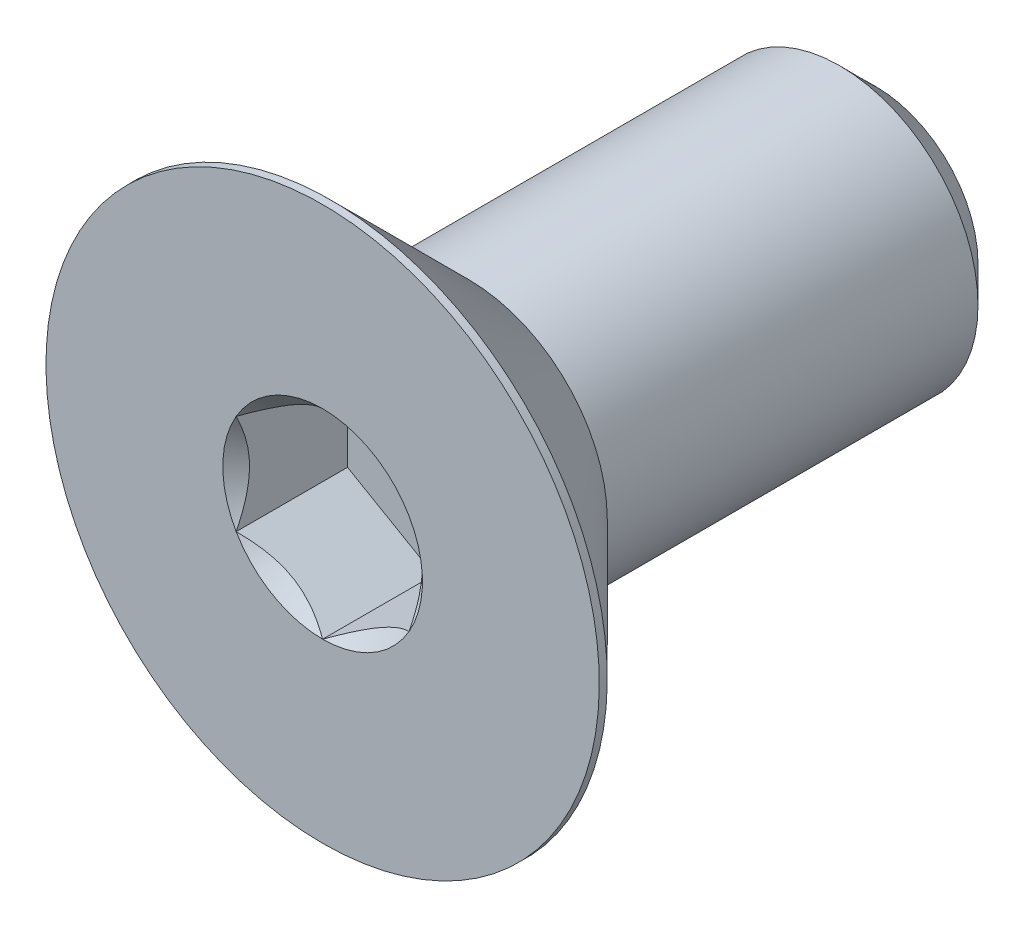
ISO-10303-21;
HEADER;
FILE_DESCRIPTION(('STEP AP214'),'2;1');
FILE_NAME('part.step','',(''),(''),'','','');
FILE_SCHEMA(('AUTOMOTIVE_DESIGN { 1 0 10303 214 1 1 1 1 }'));
ENDSEC;
DATA;
#1=APPLICATION_CONTEXT('core data for automotive mechanical design processes');
#2=APPLICATION_PROTOCOL_DEFINITION('international standard','automotive_design',2000,#1);
#3=PRODUCT_CONTEXT('',#1,'mechanical');
#4=PRODUCT('Part','Part','',(#3));
#5=PRODUCT_RELATED_PRODUCT_CATEGORY('part','',(#4));
#6=PRODUCT_DEFINITION_FORMATION('','',#4);
#7=PRODUCT_DEFINITION_CONTEXT('part definition',#1,'design');
#8=PRODUCT_DEFINITION('design','',#6,#7);
#9=PRODUCT_DEFINITION_SHAPE('','',#8);
#10=(LENGTH_UNIT() NAMED_UNIT(*) SI_UNIT(.MILLI.,.METRE.));
#11=(NAMED_UNIT(*) PLANE_ANGLE_UNIT() SI_UNIT($,.RADIAN.));
#12=(NAMED_UNIT(*) SI_UNIT($,.STERADIAN.) SOLID_ANGLE_UNIT());
#13=UNCERTAINTY_MEASURE_WITH_UNIT(LENGTH_MEASURE(1.E-05),#10,'distance_accuracy_value','');
#14=(GEOMETRIC_REPRESENTATION_CONTEXT(3) GLOBAL_UNCERTAINTY_ASSIGNED_CONTEXT((#13)) GLOBAL_UNIT_ASSIGNED_CONTEXT((#10,
#11,#12)) REPRESENTATION_CONTEXT('',''));
#15=CARTESIAN_POINT('',(0.,0.,0.));
#16=DIRECTION('',(0.,0.,1.));
#17=DIRECTION('',(1.,0.,0.));
#18=AXIS2_PLACEMENT_3D('',#15,#16,#17);
#19=CARTESIAN_POINT('',(0.,0.,3.88500000000001));
#20=DIRECTION('',(0.,0.,1.));
#21=DIRECTION('',(0.,-1.,0.));
#22=AXIS2_PLACEMENT_3D('',#19,#20,#21);
#23=CONICAL_SURFACE('',#22,4.,0.785398163397448);
#24=CARTESIAN_POINT('',(0.,0.,3.88500000000001));
#25=DIRECTION('',(0.,0.,1.));
#26=DIRECTION('',(0.,-1.,0.));
#27=AXIS2_PLACEMENT_3D('',#24,#25,#26);
#28=CIRCLE('',#27,4.);
#29=CARTESIAN_POINT('',(0.,-4.,3.88500000000001));
#30=VERTEX_POINT('',#29);
#31=EDGE_CURVE('E216',#30,#30,#28,.T.);
#32=ORIENTED_EDGE('',*,*,#31,.F.);
#33=EDGE_LOOP('',(#32));
#34=FACE_BOUND('',#33,.T.);
#35=CARTESIAN_POINT('',(0.,0.,1.88500000000001));
#36=DIRECTION('',(0.,0.,1.));
#37=DIRECTION('',(0.,-1.,0.));
#38=AXIS2_PLACEMENT_3D('',#35,#36,#37);
#39=CIRCLE('',#38,2.00000000000001);
#40=CARTESIAN_POINT('',(0.,-2.00000000000001,1.88500000000001));
#41=VERTEX_POINT('',#40);
#42=EDGE_CURVE('E43',#41,#41,#39,.T.);
#43=ORIENTED_EDGE('',*,*,#42,.T.);
#44=EDGE_LOOP('',(#43));
#45=FACE_BOUND('',#44,.T.);
#46=ADVANCED_FACE('F40',(#34,#45),#23,.T.);
#47=CARTESIAN_POINT('',(0.,0.,4.));
#48=DIRECTION('',(0.,0.,-1.));
#49=DIRECTION('',(0.,1.,0.));
#50=AXIS2_PLACEMENT_3D('',#47,#48,#49);
#51=PLANE('',#50);
#52=CARTESIAN_POINT('',(0.,0.,4.));
#53=DIRECTION('',(0.,0.,1.));
#54=DIRECTION('',(0.,-1.,0.));
#55=AXIS2_PLACEMENT_3D('',#52,#53,#54);
#56=CIRCLE('',#55,4.);
#57=CARTESIAN_POINT('',(0.,-4.,4.));
#58=VERTEX_POINT('',#57);
#59=EDGE_CURVE('E48',#58,#58,#56,.T.);
#60=ORIENTED_EDGE('',*,*,#59,.T.);
#61=EDGE_LOOP('',(#60));
#62=FACE_BOUND('',#61,.T.);
#63=CARTESIAN_POINT('',(0.,0.,4.));
#64=DIRECTION('',(0.,0.,-1.));
#65=DIRECTION('',(-1.,0.,0.));
#66=AXIS2_PLACEMENT_3D('',#63,#64,#65);
#67=CIRCLE('',#66,1.44337567297407);
#68=CARTESIAN_POINT('',(-1.25,0.72168783648703,4.));
#69=VERTEX_POINT('',#68);
#70=CARTESIAN_POINT('',(0.,1.44337567297407,4.));
#71=VERTEX_POINT('',#70);
#72=EDGE_CURVE('E130',#69,#71,#67,.T.);
#73=ORIENTED_EDGE('',*,*,#72,.T.);
#74=CARTESIAN_POINT('',(1.25,0.721687836487031,4.));
#75=VERTEX_POINT('',#74);
#76=EDGE_CURVE('E129',#71,#75,#67,.T.);
#77=ORIENTED_EDGE('',*,*,#76,.T.);
#78=CARTESIAN_POINT('',(1.25,-0.721687836487033,4.));
#79=VERTEX_POINT('',#78);
#80=EDGE_CURVE('E100',#75,#79,#67,.T.);
#81=ORIENTED_EDGE('',*,*,#80,.T.);
#82=CARTESIAN_POINT('',(0.,-1.44337567297407,4.));
#83=VERTEX_POINT('',#82);
#84=EDGE_CURVE('E93',#79,#83,#67,.T.);
#85=ORIENTED_EDGE('',*,*,#84,.T.);
#86=CARTESIAN_POINT('',(-1.25,-0.721687836487034,4.));
#87=VERTEX_POINT('',#86);
#88=EDGE_CURVE('E54',#83,#87,#67,.T.);
#89=ORIENTED_EDGE('',*,*,#88,.T.);
#90=EDGE_CURVE('E61',#87,#69,#67,.T.);
#91=ORIENTED_EDGE('',*,*,#90,.T.);
#92=EDGE_LOOP('',(#73,#77,#81,#85,#89,#91));
#93=FACE_BOUND('',#92,.T.);
#94=ADVANCED_FACE('F128',(#62,#93),#51,.F.);
#95=CARTESIAN_POINT('',(0.,0.,4.));
#96=DIRECTION('',(0.,0.,1.));
#97=DIRECTION('',(0.,-1.,0.));
#98=AXIS2_PLACEMENT_3D('',#95,#96,#97);
#99=CYLINDRICAL_SURFACE('',#98,4.);
#100=ORIENTED_EDGE('',*,*,#31,.T.);
#101=EDGE_LOOP('',(#100));
#102=FACE_BOUND('',#101,.T.);
#103=ORIENTED_EDGE('',*,*,#59,.F.);
#104=EDGE_LOOP('',(#103));
#105=FACE_BOUND('',#104,.T.);
#106=ADVANCED_FACE('F211',(#102,#105),#99,.T.);
#107=CARTESIAN_POINT('',(0.,0.,4.));
#108=DIRECTION('',(0.,0.,1.));
#109=DIRECTION('',(-1.,0.,0.));
#110=AXIS2_PLACEMENT_3D('',#107,#108,#109);
#111=CONICAL_SURFACE('',#110,1.44337567297407,0.78539816339745);
#112=CARTESIAN_POINT('',(1.25,-1.43934010808077,4.46298209689233));
#113=CARTESIAN_POINT('',(1.25,-1.40429313005659,4.43652492263289));
#114=CARTESIAN_POINT('',(1.25,-1.36905087135599,4.41032716035428));
#115=CARTESIAN_POINT('',(1.25,-1.29809650706311,4.35855757183959));
#116=CARTESIAN_POINT('',(1.25,-1.26238428576496,4.3329859043563));
#117=CARTESIAN_POINT('',(1.25,-1.15390111792708,4.25700599368947));
#118=CARTESIAN_POINT('',(1.25,-1.08031646726265,4.20774028618957));
#119=CARTESIAN_POINT('',(1.25,-0.926012322755098,4.11102583026314));
#120=CARTESIAN_POINT('',(1.25,-0.845125318656149,4.0638412989418));
#121=CARTESIAN_POINT('',(1.25,-0.679311174076604,3.97753073439042));
#122=CARTESIAN_POINT('',(1.25,-0.594398891026689,3.9383775346269));
#123=CARTESIAN_POINT('',(1.25,-0.466944812460741,3.8904772236883));
#124=CARTESIAN_POINT('',(1.25,-0.426289985812822,3.87672948978634));
#125=CARTESIAN_POINT('',(1.25,-0.343998850091268,3.85249792745055));
#126=CARTESIAN_POINT('',(1.25,-0.302362473614963,3.84201432386978));
#127=CARTESIAN_POINT('',(1.25,-0.219052696285666,3.8250301617483));
#128=CARTESIAN_POINT('',(1.25,-0.1773934284745,3.81846136047137));
#129=CARTESIAN_POINT('',(1.25,-0.0936293693401921,3.80943505345776));
#130=CARTESIAN_POINT('',(1.25,-0.0515246558543959,3.80697684099727));
#131=CARTESIAN_POINT('',(1.25,0.0311890576306318,3.80635406201329));
#132=CARTESIAN_POINT('',(1.25,0.0717969625499307,3.80803711684625));
#133=CARTESIAN_POINT('',(1.25,0.152668636885198,3.81526827059792));
#134=CARTESIAN_POINT('',(1.25,0.192932338835359,3.82081711041311));
#135=CARTESIAN_POINT('',(1.25,0.273499879165296,3.83557103646496));
#136=CARTESIAN_POINT('',(1.25,0.313792180618512,3.84483817596411));
#137=CARTESIAN_POINT('',(1.25,0.393496413911458,3.86653617845735));
#138=CARTESIAN_POINT('',(1.25,0.43290841911506,3.87896677673065));
#139=CARTESIAN_POINT('',(1.25,0.556992735862299,3.92277935293144));
#140=CARTESIAN_POINT('',(1.25,0.639898924666087,3.95915107287596));
#141=CARTESIAN_POINT('',(1.25,0.801816555499703,4.04001916217834));
#142=CARTESIAN_POINT('',(1.25,0.880812666325046,4.08454472091199));
#143=CARTESIAN_POINT('',(1.25,1.0317856127975,4.17640487666663));
#144=CARTESIAN_POINT('',(1.25,1.10391618485086,4.22348993391625));
#145=CARTESIAN_POINT('',(1.25,1.21018606043311,4.29627856159854));
#146=CARTESIAN_POINT('',(1.25,1.2451506996938,4.32079808539336));
#147=CARTESIAN_POINT('',(1.25,1.31460220852737,4.37048563676568));
#148=CARTESIAN_POINT('',(1.25,1.34908920596618,4.39565348541552));
#149=CARTESIAN_POINT('',(1.25,1.38337731682912,4.42109014884122));
#150=B_SPLINE_CURVE_WITH_KNOTS('',3,(#112,#113,#114,#115,#116,#117,#118,#119,#120,#121,#122,
#123,#124,#125,#126,#127,#128,#129,#130,#131,#132,#133,#134,#135,#136,#137,#138,#139,#140,#141,
#142,#143,#144,#145,#146,#147,#148,#149),.UNSPECIFIED.,.F.,.F.,(4,2,2,2,2,2,2,2,2,2,2,2,2,2,2,2,
2,2,4),(0.,0.131732960381448,0.263498984161645,0.529042014455826,0.80974192613462,
1.08947609717225,1.21811634272577,1.34676544783901,1.47310084517844,1.59941451973785,
1.7211504216785,1.84290966131735,1.96679153905342,2.0906630536604,2.3614669289601,
2.63325989198492,2.8915466821228,3.01965734507713,3.14773302245629),.UNSPECIFIED.);
#151=EDGE_CURVE('E11',#75,#79,#150,.F.);
#152=ORIENTED_EDGE('',*,*,#151,.T.);
#153=ORIENTED_EDGE('',*,*,#80,.F.);
#154=EDGE_LOOP('',(#152,#153));
#155=FACE_BOUND('',#154,.T.);
#156=ADVANCED_FACE('F105',(#155),#111,.F.);
#157=CARTESIAN_POINT('',(-0.000199999999999783,1.4434911430279,4.00011548390914));
#158=CARTESIAN_POINT('',(0.0427751670715868,1.41867941875065,3.9753216680551));
#159=CARTESIAN_POINT('',(0.086469004745948,1.39345276980743,3.95198373441868));
#160=CARTESIAN_POINT('',(0.175565930841942,1.34201263554194,3.90925200408454));
#161=CARTESIAN_POINT('',(0.220977498357064,1.31579425481276,3.88988199236042));
#162=CARTESIAN_POINT('',(0.312547820935259,1.26292610442246,3.85670048341348));
#163=CARTESIAN_POINT('',(0.358683240175885,1.23628980770471,3.84280555905266));
#164=CARTESIAN_POINT('',(0.451970080407592,1.18243062538508,3.82139728216064));
#165=CARTESIAN_POINT('',(0.499118649136379,1.15520938653761,3.81386794156679));
#166=CARTESIAN_POINT('',(0.580373556887251,1.10829684367467,3.8070744980507));
#167=CARTESIAN_POINT('',(0.61437487662794,1.08866617256958,3.80606855910435));
#168=CARTESIAN_POINT('',(0.682317764432476,1.04943932800611,3.80776141491132));
#169=CARTESIAN_POINT('',(0.716259317655656,1.02984316311599,3.81046102721554));
#170=CARTESIAN_POINT('',(0.783814856457498,0.9908399546035,3.81940893031638));
#171=CARTESIAN_POINT('',(0.817428507286774,0.971433104248772,3.82566052589971));
#172=CARTESIAN_POINT('',(0.884094638217812,0.932943395609906,3.8413756814139));
#173=CARTESIAN_POINT('',(0.917146871030294,0.913860680098301,3.85084062008746));
#174=CARTESIAN_POINT('',(1.00179969160026,0.864986351354569,3.87893139068759));
#175=CARTESIAN_POINT('',(1.05286649242964,0.835502920149076,3.8996701574522));
#176=CARTESIAN_POINT('',(1.15300085411326,0.777690319475908,3.94638713467148));
#177=CARTESIAN_POINT('',(1.20207431157827,0.749357745598416,3.97234829594677));
#178=CARTESIAN_POINT('',(1.2502,0.721572366433194,4.00011548390914));
#179=B_SPLINE_CURVE_WITH_KNOTS('',3,(#157,#158,#159,#160,#161,#162,#163,#164,#165,#166,#167,
#168,#169,#170,#171,#172,#173,#174,#175,#176,#177,#178),.UNSPECIFIED.,.F.,.F.,(4,2,2,2,2,2,2,2,
2,2,4),(0.,0.166533409618303,0.334037607289761,0.498880396489697,0.663307919240273,
0.780963963458825,0.898645970148451,1.01643764860773,1.13427993171549,1.32148652032141,
1.50809158792574),.UNSPECIFIED.);
#180=EDGE_CURVE('E133',#71,#75,#179,.T.);
#181=ORIENTED_EDGE('',*,*,#180,.T.);
#182=ORIENTED_EDGE('',*,*,#76,.F.);
#183=EDGE_LOOP('',(#181,#182));
#184=FACE_BOUND('',#183,.T.);
#185=ADVANCED_FACE('F252',(#184),#111,.F.);
#186=CARTESIAN_POINT('',(-1.2502,0.721572366433193,4.00011548390914));
#187=CARTESIAN_POINT('',(-1.20722483292841,0.746384090710443,3.97532166805511));
#188=CARTESIAN_POINT('',(-1.16353099525405,0.771610739653663,3.95198373441869));
#189=CARTESIAN_POINT('',(-1.07443406915806,0.823050873919153,3.90925200408454));
#190=CARTESIAN_POINT('',(-1.02902250164294,0.849269254648332,3.88988199236042));
#191=CARTESIAN_POINT('',(-0.937452179064741,0.902137405038634,3.85670048341348));
#192=CARTESIAN_POINT('',(-0.891316759824115,0.928773701756386,3.84280555905266));
#193=CARTESIAN_POINT('',(-0.798029919592408,0.982632884076012,3.82139728216064));
#194=CARTESIAN_POINT('',(-0.750881350863621,1.00985412292348,3.81386794156679));
#195=CARTESIAN_POINT('',(-0.669626443112748,1.05676666578643,3.8070744980507));
#196=CARTESIAN_POINT('',(-0.63562512337206,1.07639733689152,3.80606855910435));
#197=CARTESIAN_POINT('',(-0.567682235567523,1.11562418145499,3.80776141491132));
#198=CARTESIAN_POINT('',(-0.533740682344343,1.1352203463451,3.81046102721554));
#199=CARTESIAN_POINT('',(-0.466185143542501,1.1742235548576,3.81940893031638));
#200=CARTESIAN_POINT('',(-0.432571492713226,1.19363040521233,3.82566052589971));
#201=CARTESIAN_POINT('',(-0.365905361782188,1.23212011385119,3.8413756814139));
#202=CARTESIAN_POINT('',(-0.332853128969705,1.2512028293628,3.85084062008746));
#203=CARTESIAN_POINT('',(-0.248200308399736,1.30007715810653,3.87893139068759));
#204=CARTESIAN_POINT('',(-0.197133507570362,1.32956058931202,3.8996701574522));
#205=CARTESIAN_POINT('',(-0.0969991458867452,1.38737318998519,3.94638713467148));
#206=CARTESIAN_POINT('',(-0.0479256884217305,1.41570576386268,3.97234829594677));
#207=CARTESIAN_POINT('',(0.000200000000000116,1.4434911430279,4.00011548390914));
#208=B_SPLINE_CURVE_WITH_KNOTS('',3,(#186,#187,#188,#189,#190,#191,#192,#193,#194,#195,#196,
#197,#198,#199,#200,#201,#202,#203,#204,#205,#206,#207),.UNSPECIFIED.,.F.,.F.,(4,2,2,2,2,2,2,2,
2,2,4),(0.,0.166533409618304,0.334037607289762,0.498880396489699,0.663307919240276,
0.780963963458828,0.898645970148454,1.01643764860773,1.1342799317155,1.32148652032141,
1.50809158792574),.UNSPECIFIED.);
#209=EDGE_CURVE('E143',#69,#71,#208,.T.);
#210=ORIENTED_EDGE('',*,*,#209,.T.);
#211=ORIENTED_EDGE('',*,*,#72,.F.);
#212=EDGE_LOOP('',(#210,#211));
#213=FACE_BOUND('',#212,.T.);
#214=ADVANCED_FACE('F287',(#213),#111,.F.);
#215=CARTESIAN_POINT('',(-1.25,-1.43934010808078,4.46298209689233));
#216=CARTESIAN_POINT('',(-1.25,-1.40429313005659,4.4365249226329));
#217=CARTESIAN_POINT('',(-1.25,-1.369050871356,4.41032716035429));
#218=CARTESIAN_POINT('',(-1.25,-1.29809650706311,4.35855757183959));
#219=CARTESIAN_POINT('',(-1.25,-1.26238428576496,4.3329859043563));
#220=CARTESIAN_POINT('',(-1.25,-1.15390111792708,4.25700599368947));
#221=CARTESIAN_POINT('',(-1.25,-1.08031646726265,4.20774028618957));
#222=CARTESIAN_POINT('',(-1.25,-0.9260123227551,4.11102583026314));
#223=CARTESIAN_POINT('',(-1.25,-0.845125318656151,4.0638412989418));
#224=CARTESIAN_POINT('',(-1.25,-0.679311174076606,3.97753073439042));
#225=CARTESIAN_POINT('',(-1.25,-0.594398891026691,3.9383775346269));
#226=CARTESIAN_POINT('',(-1.25,-0.466944812460743,3.8904772236883));
#227=CARTESIAN_POINT('',(-1.25,-0.426289985812824,3.87672948978634));
#228=CARTESIAN_POINT('',(-1.25,-0.343998850091269,3.85249792745055));
#229=CARTESIAN_POINT('',(-1.25,-0.302362473614964,3.84201432386978));
#230=CARTESIAN_POINT('',(-1.25,-0.219052696285667,3.8250301617483));
#231=CARTESIAN_POINT('',(-1.25,-0.177393428474501,3.81846136047137));
#232=CARTESIAN_POINT('',(-1.25,-0.0936293693401932,3.80943505345776));
#233=CARTESIAN_POINT('',(-1.25,-0.051524655854397,3.80697684099727));
#234=CARTESIAN_POINT('',(-1.25,0.0311890576306309,3.80635406201329));
#235=CARTESIAN_POINT('',(-1.25,0.0717969625499298,3.80803711684625));
#236=CARTESIAN_POINT('',(-1.25,0.152668636885197,3.81526827059792));
#237=CARTESIAN_POINT('',(-1.25,0.192932338835358,3.82081711041311));
#238=CARTESIAN_POINT('',(-1.25,0.273499879165295,3.83557103646496));
#239=CARTESIAN_POINT('',(-1.25,0.313792180618511,3.84483817596411));
#240=CARTESIAN_POINT('',(-1.25,0.393496413911458,3.86653617845735));
#241=CARTESIAN_POINT('',(-1.25,0.43290841911506,3.87896677673065));
#242=CARTESIAN_POINT('',(-1.25,0.556992735862299,3.92277935293144));
#243=CARTESIAN_POINT('',(-1.25,0.639898924666087,3.95915107287596));
#244=CARTESIAN_POINT('',(-1.25,0.801816555499703,4.04001916217834));
#245=CARTESIAN_POINT('',(-1.25,0.880812666325046,4.08454472091199));
#246=CARTESIAN_POINT('',(-1.25,1.0317856127975,4.17640487666663));
#247=CARTESIAN_POINT('',(-1.25,1.10391618485086,4.22348993391625));
#248=CARTESIAN_POINT('',(-1.25,1.21018606043311,4.29627856159854));
#249=CARTESIAN_POINT('',(-1.25,1.2451506996938,4.32079808539336));
#250=CARTESIAN_POINT('',(-1.25,1.31460220852737,4.37048563676568));
#251=CARTESIAN_POINT('',(-1.25,1.34908920596618,4.39565348541552));
#252=CARTESIAN_POINT('',(-1.25,1.38337731682912,4.42109014884122));
#253=B_SPLINE_CURVE_WITH_KNOTS('',3,(#215,#216,#217,#218,#219,#220,#221,#222,#223,#224,#225,
#226,#227,#228,#229,#230,#231,#232,#233,#234,#235,#236,#237,#238,#239,#240,#241,#242,#243,#244,
#245,#246,#247,#248,#249,#250,#251,#252),.UNSPECIFIED.,.F.,.F.,(4,2,2,2,2,2,2,2,2,2,2,2,2,2,2,2,
2,2,4),(0.,0.131732960381449,0.263498984161647,0.529042014455828,0.809741926134623,
1.08947609717226,1.21811634272577,1.34676544783901,1.47310084517845,1.59941451973785,
1.7211504216785,1.84290966131736,1.96679153905342,2.0906630536604,2.3614669289601,
2.63325989198492,2.8915466821228,3.01965734507714,3.14773302245629),.UNSPECIFIED.);
#254=EDGE_CURVE('E172',#87,#69,#253,.T.);
#255=ORIENTED_EDGE('',*,*,#254,.T.);
#256=ORIENTED_EDGE('',*,*,#90,.F.);
#257=EDGE_LOOP('',(#255,#256));
#258=FACE_BOUND('',#257,.T.);
#259=ADVANCED_FACE('F295',(#258),#111,.F.);
#260=CARTESIAN_POINT('',(0.000199999999998896,-1.44349114302791,4.00011548390914));
#261=CARTESIAN_POINT('',(-0.0427751670715877,-1.41867941875066,3.97532166805511));
#262=CARTESIAN_POINT('',(-0.0864690047459491,-1.39345276980744,3.95198373441869));
#263=CARTESIAN_POINT('',(-0.175565930841943,-1.34201263554195,3.90925200408454));
#264=CARTESIAN_POINT('',(-0.220977498357065,-1.31579425481277,3.88988199236042));
#265=CARTESIAN_POINT('',(-0.312547820935261,-1.26292610442246,3.85670048341348));
#266=CARTESIAN_POINT('',(-0.358683240175887,-1.23628980770471,3.84280555905266));
#267=CARTESIAN_POINT('',(-0.451970080407594,-1.18243062538509,3.82139728216064));
#268=CARTESIAN_POINT('',(-0.499118649136381,-1.15520938653762,3.81386794156679));
#269=CARTESIAN_POINT('',(-0.580373556887254,-1.10829684367467,3.80707449805071));
#270=CARTESIAN_POINT('',(-0.614374876627943,-1.08866617256958,3.80606855910436));
#271=CARTESIAN_POINT('',(-0.68231776443248,-1.04943932800611,3.80776141491132));
#272=CARTESIAN_POINT('',(-0.71625931765566,-1.029843163116,3.81046102721554));
#273=CARTESIAN_POINT('',(-0.783814856457502,-0.990839954603502,3.81940893031638));
#274=CARTESIAN_POINT('',(-0.817428507286777,-0.971433104248774,3.82566052589971));
#275=CARTESIAN_POINT('',(-0.884094638217816,-0.932943395609908,3.84137568141391));
#276=CARTESIAN_POINT('',(-0.917146871030298,-0.913860680098303,3.85084062008746));
#277=CARTESIAN_POINT('',(-1.00179969160027,-0.864986351354571,3.87893139068759));
#278=CARTESIAN_POINT('',(-1.05286649242964,-0.835502920149079,3.89967015745221));
#279=CARTESIAN_POINT('',(-1.15300085411326,-0.777690319475912,3.94638713467148));
#280=CARTESIAN_POINT('',(-1.20207431157827,-0.74935774559842,3.97234829594677));
#281=CARTESIAN_POINT('',(-1.2502,-0.721572366433198,4.00011548390914));
#282=B_SPLINE_CURVE_WITH_KNOTS('',3,(#260,#261,#262,#263,#264,#265,#266,#267,#268,#269,#270,
#271,#272,#273,#274,#275,#276,#277,#278,#279,#280,#281),.UNSPECIFIED.,.F.,.F.,(4,2,2,2,2,2,2,2,
2,2,4),(0.,0.166533409618304,0.334037607289762,0.498880396489698,0.663307919240275,
0.780963963458828,0.898645970148454,1.01643764860773,1.1342799317155,1.32148652032141,
1.50809158792574),.UNSPECIFIED.);
#283=EDGE_CURVE('E117',#83,#87,#282,.T.);
#284=ORIENTED_EDGE('',*,*,#283,.T.);
#285=ORIENTED_EDGE('',*,*,#88,.F.);
#286=EDGE_LOOP('',(#284,#285));
#287=FACE_BOUND('',#286,.T.);
#288=ADVANCED_FACE('F158',(#287),#111,.F.);
#289=CARTESIAN_POINT('',(1.2502,-0.721572366433196,4.00011548390914));
#290=CARTESIAN_POINT('',(1.20722483292841,-0.746384090710446,3.97532166805511));
#291=CARTESIAN_POINT('',(1.16353099525405,-0.771610739653666,3.95198373441869));
#292=CARTESIAN_POINT('',(1.07443406915806,-0.823050873919156,3.90925200408454));
#293=CARTESIAN_POINT('',(1.02902250164294,-0.849269254648335,3.88988199236042));
#294=CARTESIAN_POINT('',(0.937452179064742,-0.902137405038637,3.85670048341348));
#295=CARTESIAN_POINT('',(0.891316759824117,-0.928773701756389,3.84280555905266));
#296=CARTESIAN_POINT('',(0.79802991959241,-0.982632884076014,3.82139728216064));
#297=CARTESIAN_POINT('',(0.750881350863623,-1.00985412292349,3.81386794156679));
#298=CARTESIAN_POINT('',(0.66962644311275,-1.05676666578643,3.80707449805071));
#299=CARTESIAN_POINT('',(0.635625123372061,-1.07639733689152,3.80606855910435));
#300=CARTESIAN_POINT('',(0.567682235567525,-1.11562418145499,3.80776141491132));
#301=CARTESIAN_POINT('',(0.533740682344345,-1.13522034634511,3.81046102721554));
#302=CARTESIAN_POINT('',(0.466185143542503,-1.1742235548576,3.81940893031638));
#303=CARTESIAN_POINT('',(0.432571492713227,-1.19363040521233,3.82566052589971));
#304=CARTESIAN_POINT('',(0.365905361782189,-1.23212011385119,3.84137568141391));
#305=CARTESIAN_POINT('',(0.332853128969706,-1.2512028293628,3.85084062008746));
#306=CARTESIAN_POINT('',(0.248200308399737,-1.30007715810653,3.87893139068759));
#307=CARTESIAN_POINT('',(0.197133507570363,-1.32956058931202,3.8996701574522));
#308=CARTESIAN_POINT('',(0.0969991458867453,-1.38737318998519,3.94638713467148));
#309=CARTESIAN_POINT('',(0.0479256884217301,-1.41570576386268,3.97234829594677));
#310=CARTESIAN_POINT('',(-0.000200000000001046,-1.44349114302791,4.00011548390914));
#311=B_SPLINE_CURVE_WITH_KNOTS('',3,(#289,#290,#291,#292,#293,#294,#295,#296,#297,#298,#299,
#300,#301,#302,#303,#304,#305,#306,#307,#308,#309,#310),.UNSPECIFIED.,.F.,.F.,(4,2,2,2,2,2,2,2,
2,2,4),(0.,0.166533409618303,0.334037607289761,0.498880396489698,0.663307919240274,
0.780963963458826,0.898645970148452,1.01643764860773,1.13427993171549,1.32148652032141,
1.50809158792574),.UNSPECIFIED.);
#312=EDGE_CURVE('E96',#79,#83,#311,.T.);
#313=ORIENTED_EDGE('',*,*,#312,.T.);
#314=ORIENTED_EDGE('',*,*,#84,.F.);
#315=EDGE_LOOP('',(#313,#314));
#316=FACE_BOUND('',#315,.T.);
#317=ADVANCED_FACE('F94',(#316),#111,.F.);
#318=CARTESIAN_POINT('',(1.25,-0.721687836487034,2.39));
#319=DIRECTION('',(0.,0.,1.));
#320=DIRECTION('',(1.,0.,0.));
#321=AXIS2_PLACEMENT_3D('',#318,#319,#320);
#322=PLANE('',#321);
#323=DIRECTION('',(0.866025403784438,0.5,0.));
#324=VECTOR('',#323,1.);
#325=CARTESIAN_POINT('',(0.,-1.44337567297407,2.39));
#326=LINE('',#325,#324);
#327=CARTESIAN_POINT('',(0.,-1.44337567297407,2.39));
#328=VERTEX_POINT('',#327);
#329=CARTESIAN_POINT('',(1.25,-0.721687836487034,2.39));
#330=VERTEX_POINT('',#329);
#331=EDGE_CURVE('E116',#328,#330,#326,.T.);
#332=ORIENTED_EDGE('',*,*,#331,.T.);
#333=DIRECTION('',(0.,1.,0.));
#334=VECTOR('',#333,1.);
#335=CARTESIAN_POINT('',(1.25,-0.721687836487034,2.39));
#336=LINE('',#335,#334);
#337=CARTESIAN_POINT('',(1.25,0.721687836487031,2.39));
#338=VERTEX_POINT('',#337);
#339=EDGE_CURVE('E121',#330,#338,#336,.T.);
#340=ORIENTED_EDGE('',*,*,#339,.T.);
#341=DIRECTION('',(-0.866025403784439,0.5,0.));
#342=VECTOR('',#341,1.);
#343=CARTESIAN_POINT('',(1.25,0.721687836487031,2.39));
#344=LINE('',#343,#342);
#345=CARTESIAN_POINT('',(0.,1.44337567297406,2.39));
#346=VERTEX_POINT('',#345);
#347=EDGE_CURVE('E277',#338,#346,#344,.T.);
#348=ORIENTED_EDGE('',*,*,#347,.T.);
#349=DIRECTION('',(-0.866025403784439,-0.5,0.));
#350=VECTOR('',#349,1.);
#351=CARTESIAN_POINT('',(0.,1.44337567297406,2.39));
#352=LINE('',#351,#350);
#353=CARTESIAN_POINT('',(-1.25,0.721687836487031,2.39));
#354=VERTEX_POINT('',#353);
#355=EDGE_CURVE('E274',#346,#354,#352,.T.);
#356=ORIENTED_EDGE('',*,*,#355,.T.);
#357=DIRECTION('',(0.,-1.,0.));
#358=VECTOR('',#357,1.);
#359=CARTESIAN_POINT('',(-1.25,0.721687836487031,2.39));
#360=LINE('',#359,#358);
#361=CARTESIAN_POINT('',(-1.25,-0.721687836487036,2.39));
#362=VERTEX_POINT('',#361);
#363=EDGE_CURVE('E271',#354,#362,#360,.T.);
#364=ORIENTED_EDGE('',*,*,#363,.T.);
#365=DIRECTION('',(0.866025403784439,-0.5,0.));
#366=VECTOR('',#365,1.);
#367=CARTESIAN_POINT('',(-1.25,-0.721687836487036,2.39));
#368=LINE('',#367,#366);
#369=EDGE_CURVE('E124',#362,#328,#368,.T.);
#370=ORIENTED_EDGE('',*,*,#369,.T.);
#371=EDGE_LOOP('',(#332,#340,#348,#356,#364,#370));
#372=FACE_BOUND('',#371,.T.);
#373=ADVANCED_FACE('F157',(#372),#322,.T.);
#374=CARTESIAN_POINT('',(1.25,-0.721687836487034,2.39));
#375=DIRECTION('',(1.,0.,0.));
#376=DIRECTION('',(0.,1.,0.));
#377=AXIS2_PLACEMENT_3D('',#374,#375,#376);
#378=PLANE('',#377);
#379=ORIENTED_EDGE('',*,*,#151,.F.);
#380=DIRECTION('',(0.,0.,1.));
#381=VECTOR('',#380,1.);
#382=CARTESIAN_POINT('',(1.25,0.721687836487031,2.39));
#383=LINE('',#382,#381);
#384=EDGE_CURVE('E123',#338,#75,#383,.T.);
#385=ORIENTED_EDGE('',*,*,#384,.F.);
#386=ORIENTED_EDGE('',*,*,#339,.F.);
#387=DIRECTION('',(0.,0.,1.));
#388=VECTOR('',#387,1.);
#389=CARTESIAN_POINT('',(1.25,-0.721687836487034,2.39));
#390=LINE('',#389,#388);
#391=EDGE_CURVE('E113',#330,#79,#390,.T.);
#392=ORIENTED_EDGE('',*,*,#391,.T.);
#393=EDGE_LOOP('',(#379,#385,#386,#392));
#394=FACE_BOUND('',#393,.T.);
#395=ADVANCED_FACE('F119',(#394),#378,.F.);
#396=CARTESIAN_POINT('',(1.25,0.721687836487031,2.39));
#397=DIRECTION('',(0.5,0.866025403784439,0.));
#398=DIRECTION('',(-0.866025403784439,0.5,0.));
#399=AXIS2_PLACEMENT_3D('',#396,#397,#398);
#400=PLANE('',#399);
#401=ORIENTED_EDGE('',*,*,#180,.F.);
#402=DIRECTION('',(0.,0.,1.));
#403=VECTOR('',#402,1.);
#404=CARTESIAN_POINT('',(0.,1.44337567297406,2.39));
#405=LINE('',#404,#403);
#406=EDGE_CURVE('E259',#346,#71,#405,.T.);
#407=ORIENTED_EDGE('',*,*,#406,.F.);
#408=ORIENTED_EDGE('',*,*,#347,.F.);
#409=ORIENTED_EDGE('',*,*,#384,.T.);
#410=EDGE_LOOP('',(#401,#407,#408,#409));
#411=FACE_BOUND('',#410,.T.);
#412=ADVANCED_FACE('F150',(#411),#400,.F.);
#413=CARTESIAN_POINT('',(0.,1.44337567297406,2.39));
#414=DIRECTION('',(-0.5,0.866025403784438,0.));
#415=DIRECTION('',(-0.866025403784439,-0.5,0.));
#416=AXIS2_PLACEMENT_3D('',#413,#414,#415);
#417=PLANE('',#416);
#418=ORIENTED_EDGE('',*,*,#209,.F.);
#419=DIRECTION('',(0.,0.,1.));
#420=VECTOR('',#419,1.);
#421=CARTESIAN_POINT('',(-1.25,0.721687836487031,2.39));
#422=LINE('',#421,#420);
#423=EDGE_CURVE('E262',#354,#69,#422,.T.);
#424=ORIENTED_EDGE('',*,*,#423,.F.);
#425=ORIENTED_EDGE('',*,*,#355,.F.);
#426=ORIENTED_EDGE('',*,*,#406,.T.);
#427=EDGE_LOOP('',(#418,#424,#425,#426));
#428=FACE_BOUND('',#427,.T.);
#429=ADVANCED_FACE('F196',(#428),#417,.F.);
#430=CARTESIAN_POINT('',(-1.25,0.721687836487031,2.39));
#431=DIRECTION('',(-1.,0.,0.));
#432=DIRECTION('',(0.,-1.,0.));
#433=AXIS2_PLACEMENT_3D('',#430,#431,#432);
#434=PLANE('',#433);
#435=ORIENTED_EDGE('',*,*,#254,.F.);
#436=DIRECTION('',(0.,0.,1.));
#437=VECTOR('',#436,1.);
#438=CARTESIAN_POINT('',(-1.25,-0.721687836487036,2.39));
#439=LINE('',#438,#437);
#440=EDGE_CURVE('E265',#362,#87,#439,.T.);
#441=ORIENTED_EDGE('',*,*,#440,.F.);
#442=ORIENTED_EDGE('',*,*,#363,.F.);
#443=ORIENTED_EDGE('',*,*,#423,.T.);
#444=EDGE_LOOP('',(#435,#441,#442,#443));
#445=FACE_BOUND('',#444,.T.);
#446=ADVANCED_FACE('F192',(#445),#434,.F.);
#447=CARTESIAN_POINT('',(-1.25,-0.721687836487036,2.39));
#448=DIRECTION('',(-0.5,-0.866025403784439,0.));
#449=DIRECTION('',(0.866025403784439,-0.5,0.));
#450=AXIS2_PLACEMENT_3D('',#447,#448,#449);
#451=PLANE('',#450);
#452=ORIENTED_EDGE('',*,*,#283,.F.);
#453=DIRECTION('',(0.,0.,1.));
#454=VECTOR('',#453,1.);
#455=CARTESIAN_POINT('',(0.,-1.44337567297407,2.39));
#456=LINE('',#455,#454);
#457=EDGE_CURVE('E115',#328,#83,#456,.T.);
#458=ORIENTED_EDGE('',*,*,#457,.F.);
#459=ORIENTED_EDGE('',*,*,#369,.F.);
#460=ORIENTED_EDGE('',*,*,#440,.T.);
#461=EDGE_LOOP('',(#452,#458,#459,#460));
#462=FACE_BOUND('',#461,.T.);
#463=ADVANCED_FACE('F189',(#462),#451,.F.);
#464=CARTESIAN_POINT('',(0.,-1.44337567297407,2.39));
#465=DIRECTION('',(0.5,-0.866025403784438,0.));
#466=DIRECTION('',(0.866025403784438,0.5,0.));
#467=AXIS2_PLACEMENT_3D('',#464,#465,#466);
#468=PLANE('',#467);
#469=ORIENTED_EDGE('',*,*,#312,.F.);
#470=ORIENTED_EDGE('',*,*,#391,.F.);
#471=ORIENTED_EDGE('',*,*,#331,.F.);
#472=ORIENTED_EDGE('',*,*,#457,.T.);
#473=EDGE_LOOP('',(#469,#470,#471,#472));
#474=FACE_BOUND('',#473,.T.);
#475=ADVANCED_FACE('F111',(#474),#468,.F.);
#476=CARTESIAN_POINT('',(0.,-2.,-4.00000000000001));
#477=DIRECTION('',(0.,0.,1.));
#478=DIRECTION('',(0.,-1.,0.));
#479=AXIS2_PLACEMENT_3D('',#476,#477,#478);
#480=PLANE('',#479);
#481=CARTESIAN_POINT('',(0.,0.,-4.00000000000001));
#482=DIRECTION('',(0.,0.,1.));
#483=DIRECTION('',(0.,-1.,0.));
#484=AXIS2_PLACEMENT_3D('',#481,#482,#483);
#485=CIRCLE('',#484,1.475);
#486=CARTESIAN_POINT('',(0.,-1.475,-4.00000000000001));
#487=VERTEX_POINT('',#486);
#488=EDGE_CURVE('E134',#487,#487,#485,.F.);
#489=ORIENTED_EDGE('',*,*,#488,.T.);
#490=EDGE_LOOP('',(#489));
#491=FACE_BOUND('',#490,.T.);
#492=ADVANCED_FACE('F234',(#491),#480,.F.);
#493=CARTESIAN_POINT('',(0.,0.,2.39));
#494=DIRECTION('',(0.,0.,1.));
#495=DIRECTION('',(0.,-1.,0.));
#496=AXIS2_PLACEMENT_3D('',#493,#494,#495);
#497=CYLINDRICAL_SURFACE('',#496,2.00000000000001);
#498=ORIENTED_EDGE('',*,*,#42,.F.);
#499=EDGE_LOOP('',(#498));
#500=FACE_BOUND('',#499,.T.);
#501=CARTESIAN_POINT('',(0.,0.,-3.47500000000001));
#502=DIRECTION('',(0.,0.,1.));
#503=DIRECTION('',(0.,-1.,0.));
#504=AXIS2_PLACEMENT_3D('',#501,#502,#503);
#505=CIRCLE('',#504,2.00000000000001);
#506=CARTESIAN_POINT('',(0.,-2.00000000000001,-3.47500000000001));
#507=VERTEX_POINT('',#506);
#508=EDGE_CURVE('E221',#507,#507,#505,.T.);
#509=ORIENTED_EDGE('',*,*,#508,.T.);
#510=EDGE_LOOP('',(#509));
#511=FACE_BOUND('',#510,.T.);
#512=ADVANCED_FACE('F227',(#500,#511),#497,.T.);
#513=CARTESIAN_POINT('',(0.,0.,-3.47500000000001));
#514=DIRECTION('',(0.,0.,1.));
#515=DIRECTION('',(0.,-1.,0.));
#516=AXIS2_PLACEMENT_3D('',#513,#514,#515);
#517=CONICAL_SURFACE('',#516,2.00000000000001,0.78539816339745);
#518=ORIENTED_EDGE('',*,*,#488,.F.);
#519=EDGE_LOOP('',(#518));
#520=FACE_BOUND('',#519,.T.);
#521=ORIENTED_EDGE('',*,*,#508,.F.);
#522=EDGE_LOOP('',(#521));
#523=FACE_BOUND('',#522,.T.);
#524=ADVANCED_FACE('F159',(#520,#523),#517,.T.);
#525=CLOSED_SHELL('',(#46,#94,#106,#156,#185,#214,#259,#288,#317,#373,#395,#412,#429,#446,#463,
#475,#492,#512,#524));
#526=MANIFOLD_SOLID_BREP('B2',#525);
#527=ADVANCED_BREP_SHAPE_REPRESENTATION('',(#18,#526),#14);
#528=SHAPE_DEFINITION_REPRESENTATION(#9,#527);
ENDSEC;
END-ISO-10303-21;
